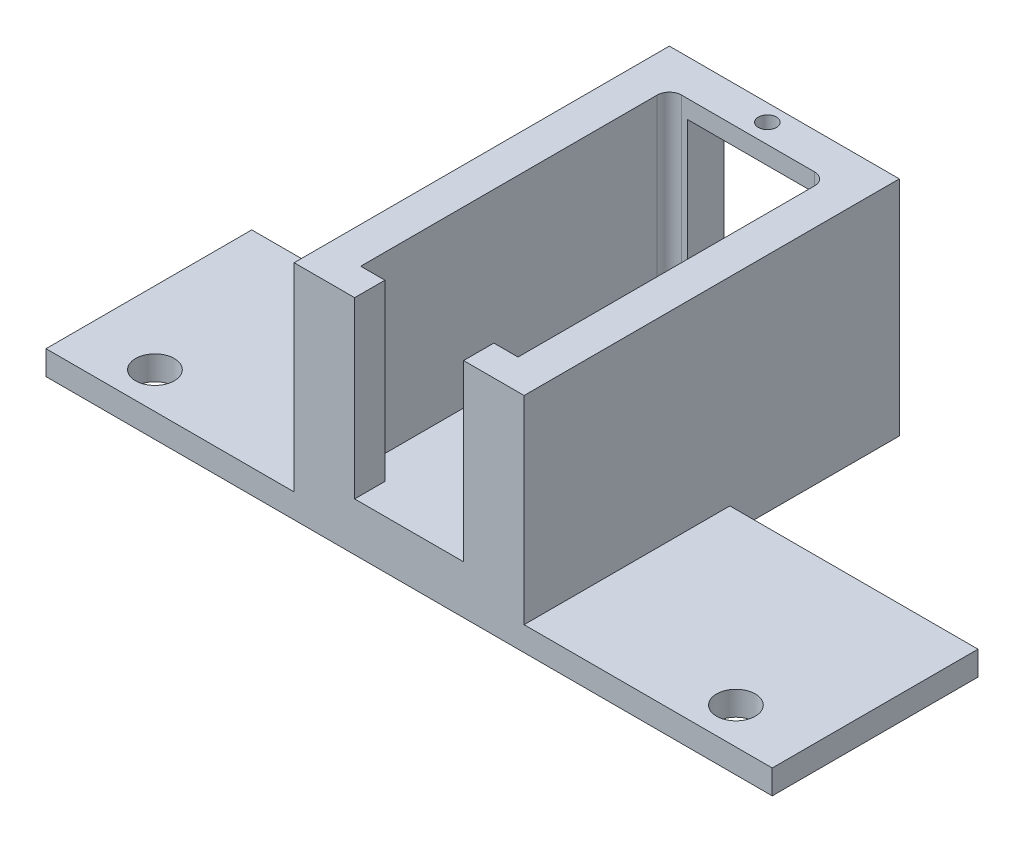
ISO-10303-21;
HEADER;
FILE_DESCRIPTION(('STEP AP214'),'2;1');
FILE_NAME('part.step','',(''),(''),'','','');
FILE_SCHEMA(('AUTOMOTIVE_DESIGN { 1 0 10303 214 1 1 1 1 }'));
ENDSEC;
DATA;
#1=APPLICATION_CONTEXT('core data for automotive mechanical design processes');
#2=APPLICATION_PROTOCOL_DEFINITION('international standard','automotive_design',2000,#1);
#3=PRODUCT_CONTEXT('',#1,'mechanical');
#4=PRODUCT('Part','Part','',(#3));
#5=PRODUCT_RELATED_PRODUCT_CATEGORY('part','',(#4));
#6=PRODUCT_DEFINITION_FORMATION('','',#4);
#7=PRODUCT_DEFINITION_CONTEXT('part definition',#1,'design');
#8=PRODUCT_DEFINITION('design','',#6,#7);
#9=PRODUCT_DEFINITION_SHAPE('','',#8);
#10=(LENGTH_UNIT() NAMED_UNIT(*) SI_UNIT(.MILLI.,.METRE.));
#11=(NAMED_UNIT(*) PLANE_ANGLE_UNIT() SI_UNIT($,.RADIAN.));
#12=(NAMED_UNIT(*) SI_UNIT($,.STERADIAN.) SOLID_ANGLE_UNIT());
#13=UNCERTAINTY_MEASURE_WITH_UNIT(LENGTH_MEASURE(1.E-05),#10,'distance_accuracy_value','');
#14=(GEOMETRIC_REPRESENTATION_CONTEXT(3) GLOBAL_UNCERTAINTY_ASSIGNED_CONTEXT((#13)) GLOBAL_UNIT_ASSIGNED_CONTEXT((#10,
#11,#12)) REPRESENTATION_CONTEXT('',''));
#15=CARTESIAN_POINT('',(0.,0.,0.));
#16=DIRECTION('',(0.,0.,1.));
#17=DIRECTION('',(1.,0.,0.));
#18=AXIS2_PLACEMENT_3D('',#15,#16,#17);
#19=CARTESIAN_POINT('',(-30.,4.,-8.5));
#20=DIRECTION('',(0.,0.,1.));
#21=DIRECTION('',(1.,0.,0.));
#22=AXIS2_PLACEMENT_3D('',#19,#20,#21);
#23=PLANE('',#22);
#24=DIRECTION('',(1.,0.,0.));
#25=VECTOR('',#24,1.);
#26=CARTESIAN_POINT('',(30.,2.,-8.49999999999995));
#27=LINE('',#26,#25);
#28=CARTESIAN_POINT('',(9.49999999999995,2.,-8.49999999999995));
#29=VERTEX_POINT('',#28);
#30=CARTESIAN_POINT('',(30.,2.,-8.49999999999995));
#31=VERTEX_POINT('',#30);
#32=EDGE_CURVE('E270',#29,#31,#27,.T.);
#33=ORIENTED_EDGE('',*,*,#32,.T.);
#34=DIRECTION('',(0.,-1.,0.));
#35=VECTOR('',#34,1.);
#36=CARTESIAN_POINT('',(30.,4.,-8.5));
#37=LINE('',#36,#35);
#38=CARTESIAN_POINT('',(30.,0.,-8.5));
#39=VERTEX_POINT('',#38);
#40=EDGE_CURVE('E469',#31,#39,#37,.T.);
#41=ORIENTED_EDGE('',*,*,#40,.T.);
#42=DIRECTION('',(-1.,0.,0.));
#43=VECTOR('',#42,1.);
#44=CARTESIAN_POINT('',(-30.,0.,-8.5));
#45=LINE('',#44,#43);
#46=CARTESIAN_POINT('',(9.5,0.,-8.5));
#47=VERTEX_POINT('',#46);
#48=EDGE_CURVE('E448',#39,#47,#45,.T.);
#49=ORIENTED_EDGE('',*,*,#48,.T.);
#50=DIRECTION('',(0.,-1.,0.));
#51=VECTOR('',#50,1.);
#52=CARTESIAN_POINT('',(9.5,4.,-8.5));
#53=LINE('',#52,#51);
#54=EDGE_CURVE('E424',#29,#47,#53,.T.);
#55=ORIENTED_EDGE('',*,*,#54,.F.);
#56=EDGE_LOOP('',(#33,#41,#49,#55));
#57=FACE_BOUND('',#56,.T.);
#58=ADVANCED_FACE('F45',(#57),#23,.F.);
#59=CARTESIAN_POINT('',(30.,4.,8.5));
#60=DIRECTION('',(-1.,0.,0.));
#61=DIRECTION('',(0.,0.,1.));
#62=AXIS2_PLACEMENT_3D('',#59,#60,#61);
#63=PLANE('',#62);
#64=DIRECTION('',(0.,0.,1.));
#65=VECTOR('',#64,1.);
#66=CARTESIAN_POINT('',(30.,2.,-8.49999999999995));
#67=LINE('',#66,#65);
#68=CARTESIAN_POINT('',(30.,2.,8.49999999999995));
#69=VERTEX_POINT('',#68);
#70=EDGE_CURVE('E266',#31,#69,#67,.T.);
#71=ORIENTED_EDGE('',*,*,#70,.T.);
#72=DIRECTION('',(0.,-1.,0.));
#73=VECTOR('',#72,1.);
#74=CARTESIAN_POINT('',(30.,4.,8.5));
#75=LINE('',#74,#73);
#76=CARTESIAN_POINT('',(30.,0.,8.5));
#77=VERTEX_POINT('',#76);
#78=EDGE_CURVE('E460',#69,#77,#75,.T.);
#79=ORIENTED_EDGE('',*,*,#78,.T.);
#80=DIRECTION('',(0.,0.,-1.));
#81=VECTOR('',#80,1.);
#82=CARTESIAN_POINT('',(30.,0.,8.5));
#83=LINE('',#82,#81);
#84=EDGE_CURVE('E443',#77,#39,#83,.T.);
#85=ORIENTED_EDGE('',*,*,#84,.T.);
#86=ORIENTED_EDGE('',*,*,#40,.F.);
#87=EDGE_LOOP('',(#71,#79,#85,#86));
#88=FACE_BOUND('',#87,.T.);
#89=ADVANCED_FACE('F521',(#88),#63,.F.);
#90=CARTESIAN_POINT('',(-30.,4.,8.5));
#91=DIRECTION('',(0.,0.,-1.));
#92=DIRECTION('',(-1.,0.,0.));
#93=AXIS2_PLACEMENT_3D('',#90,#91,#92);
#94=PLANE('',#93);
#95=DIRECTION('',(-1.,0.,0.));
#96=VECTOR('',#95,1.);
#97=CARTESIAN_POINT('',(30.,2.,8.49999999999995));
#98=LINE('',#97,#96);
#99=CARTESIAN_POINT('',(9.49999999999995,2.,8.49999999999995));
#100=VERTEX_POINT('',#99);
#101=EDGE_CURVE('E277',#69,#100,#98,.T.);
#102=ORIENTED_EDGE('',*,*,#101,.T.);
#103=DIRECTION('',(0.,-1.,0.));
#104=VECTOR('',#103,1.);
#105=CARTESIAN_POINT('',(9.49999999999999,18.4,8.5));
#106=LINE('',#105,#104);
#107=CARTESIAN_POINT('',(9.49999999999999,18.4,8.5));
#108=VERTEX_POINT('',#107);
#109=EDGE_CURVE('E391',#108,#100,#106,.T.);
#110=ORIENTED_EDGE('',*,*,#109,.F.);
#111=DIRECTION('',(1.,0.,0.));
#112=VECTOR('',#111,1.);
#113=CARTESIAN_POINT('',(-9.49999999999999,18.4,8.5));
#114=LINE('',#113,#112);
#115=CARTESIAN_POINT('',(4.5,18.4,8.5));
#116=VERTEX_POINT('',#115);
#117=EDGE_CURVE('E402',#116,#108,#114,.T.);
#118=ORIENTED_EDGE('',*,*,#117,.F.);
#119=DIRECTION('',(0.,1.,0.));
#120=VECTOR('',#119,1.);
#121=CARTESIAN_POINT('',(4.5,4.,8.5));
#122=LINE('',#121,#120);
#123=CARTESIAN_POINT('',(4.5,4.,8.5));
#124=VERTEX_POINT('',#123);
#125=EDGE_CURVE('E361',#124,#116,#122,.T.);
#126=ORIENTED_EDGE('',*,*,#125,.F.);
#127=DIRECTION('',(1.,0.,0.));
#128=VECTOR('',#127,1.);
#129=CARTESIAN_POINT('',(-4.5,4.,8.5));
#130=LINE('',#129,#128);
#131=CARTESIAN_POINT('',(-4.5,4.,8.5));
#132=VERTEX_POINT('',#131);
#133=EDGE_CURVE('E341',#132,#124,#130,.T.);
#134=ORIENTED_EDGE('',*,*,#133,.F.);
#135=DIRECTION('',(0.,1.,0.));
#136=VECTOR('',#135,1.);
#137=CARTESIAN_POINT('',(-4.5,4.,8.5));
#138=LINE('',#137,#136);
#139=CARTESIAN_POINT('',(-4.5,18.4,8.5));
#140=VERTEX_POINT('',#139);
#141=EDGE_CURVE('E348',#132,#140,#138,.T.);
#142=ORIENTED_EDGE('',*,*,#141,.T.);
#143=CARTESIAN_POINT('',(-9.49999999999999,18.4,8.5));
#144=VERTEX_POINT('',#143);
#145=EDGE_CURVE('E403',#144,#140,#114,.T.);
#146=ORIENTED_EDGE('',*,*,#145,.F.);
#147=DIRECTION('',(0.,-1.,0.));
#148=VECTOR('',#147,1.);
#149=CARTESIAN_POINT('',(-9.49999999999999,18.4,8.5));
#150=LINE('',#149,#148);
#151=CARTESIAN_POINT('',(-9.49999999999995,2.,8.49999999999995));
#152=VERTEX_POINT('',#151);
#153=EDGE_CURVE('E414',#144,#152,#150,.T.);
#154=ORIENTED_EDGE('',*,*,#153,.T.);
#155=DIRECTION('',(1.,0.,0.));
#156=VECTOR('',#155,1.);
#157=CARTESIAN_POINT('',(-30.,2.,8.49999999999995));
#158=LINE('',#157,#156);
#159=CARTESIAN_POINT('',(-30.,2.,8.49999999999995));
#160=VERTEX_POINT('',#159);
#161=EDGE_CURVE('E284',#160,#152,#158,.T.);
#162=ORIENTED_EDGE('',*,*,#161,.F.);
#163=DIRECTION('',(0.,-1.,0.));
#164=VECTOR('',#163,1.);
#165=CARTESIAN_POINT('',(-30.,4.,8.5));
#166=LINE('',#165,#164);
#167=CARTESIAN_POINT('',(-30.,0.,8.5));
#168=VERTEX_POINT('',#167);
#169=EDGE_CURVE('E463',#160,#168,#166,.T.);
#170=ORIENTED_EDGE('',*,*,#169,.T.);
#171=DIRECTION('',(1.,0.,0.));
#172=VECTOR('',#171,1.);
#173=CARTESIAN_POINT('',(-30.,0.,8.5));
#174=LINE('',#173,#172);
#175=EDGE_CURVE('E456',#168,#77,#174,.T.);
#176=ORIENTED_EDGE('',*,*,#175,.T.);
#177=ORIENTED_EDGE('',*,*,#78,.F.);
#178=EDGE_LOOP('',(#102,#110,#118,#126,#134,#142,#146,#154,#162,#170,#176,#177));
#179=FACE_BOUND('',#178,.T.);
#180=ADVANCED_FACE('F526',(#179),#94,.F.);
#181=CARTESIAN_POINT('',(24.,0.,5.5));
#182=DIRECTION('',(0.,1.,0.));
#183=DIRECTION('',(0.,0.,1.));
#184=AXIS2_PLACEMENT_3D('',#181,#182,#183);
#185=CYLINDRICAL_SURFACE('',#184,1.6);
#186=CARTESIAN_POINT('',(24.,0.,5.5));
#187=DIRECTION('',(0.,1.,0.));
#188=DIRECTION('',(0.,0.,1.));
#189=AXIS2_PLACEMENT_3D('',#186,#187,#188);
#190=CIRCLE('',#189,1.6);
#191=CARTESIAN_POINT('',(24.,0.,7.1));
#192=VERTEX_POINT('',#191);
#193=EDGE_CURVE('E299',#192,#192,#190,.T.);
#194=ORIENTED_EDGE('',*,*,#193,.F.);
#195=EDGE_LOOP('',(#194));
#196=FACE_BOUND('',#195,.T.);
#197=CARTESIAN_POINT('',(24.,2.,5.5));
#198=DIRECTION('',(0.,1.,0.));
#199=DIRECTION('',(0.,0.,1.));
#200=AXIS2_PLACEMENT_3D('',#197,#198,#199);
#201=CIRCLE('',#200,1.6);
#202=CARTESIAN_POINT('',(24.,2.,7.1));
#203=VERTEX_POINT('',#202);
#204=EDGE_CURVE('E49',#203,#203,#201,.F.);
#205=ORIENTED_EDGE('',*,*,#204,.F.);
#206=EDGE_LOOP('',(#205));
#207=FACE_BOUND('',#206,.T.);
#208=ADVANCED_FACE('F530',(#196,#207),#185,.F.);
#209=DIRECTION('',(-1.,0.,0.));
#210=VECTOR('',#209,1.);
#211=CARTESIAN_POINT('',(-30.,2.,-8.49999999999995));
#212=LINE('',#211,#210);
#213=CARTESIAN_POINT('',(-9.49999999999995,2.,-8.49999999999995));
#214=VERTEX_POINT('',#213);
#215=CARTESIAN_POINT('',(-30.,2.,-8.49999999999995));
#216=VERTEX_POINT('',#215);
#217=EDGE_CURVE('E291',#214,#216,#212,.T.);
#218=ORIENTED_EDGE('',*,*,#217,.F.);
#219=DIRECTION('',(0.,1.,0.));
#220=VECTOR('',#219,1.);
#221=CARTESIAN_POINT('',(-9.5,4.,-8.5));
#222=LINE('',#221,#220);
#223=CARTESIAN_POINT('',(-9.5,0.,-8.5));
#224=VERTEX_POINT('',#223);
#225=EDGE_CURVE('E419',#224,#214,#222,.T.);
#226=ORIENTED_EDGE('',*,*,#225,.F.);
#227=CARTESIAN_POINT('',(-30.,0.,-8.5));
#228=VERTEX_POINT('',#227);
#229=EDGE_CURVE('E447',#224,#228,#45,.T.);
#230=ORIENTED_EDGE('',*,*,#229,.T.);
#231=DIRECTION('',(0.,-1.,0.));
#232=VECTOR('',#231,1.);
#233=CARTESIAN_POINT('',(-30.,4.,-8.5));
#234=LINE('',#233,#232);
#235=EDGE_CURVE('E466',#216,#228,#234,.T.);
#236=ORIENTED_EDGE('',*,*,#235,.F.);
#237=EDGE_LOOP('',(#218,#226,#230,#236));
#238=FACE_BOUND('',#237,.T.);
#239=ADVANCED_FACE('F514',(#238),#23,.F.);
#240=CARTESIAN_POINT('',(-30.,4.,8.5));
#241=DIRECTION('',(1.,0.,0.));
#242=DIRECTION('',(0.,0.,-1.));
#243=AXIS2_PLACEMENT_3D('',#240,#241,#242);
#244=PLANE('',#243);
#245=DIRECTION('',(0.,0.,1.));
#246=VECTOR('',#245,1.);
#247=CARTESIAN_POINT('',(-30.,2.,-8.49999999999995));
#248=LINE('',#247,#246);
#249=EDGE_CURVE('E281',#216,#160,#248,.T.);
#250=ORIENTED_EDGE('',*,*,#249,.F.);
#251=ORIENTED_EDGE('',*,*,#235,.T.);
#252=DIRECTION('',(0.,0.,1.));
#253=VECTOR('',#252,1.);
#254=CARTESIAN_POINT('',(-30.,0.,8.5));
#255=LINE('',#254,#253);
#256=EDGE_CURVE('E452',#228,#168,#255,.T.);
#257=ORIENTED_EDGE('',*,*,#256,.T.);
#258=ORIENTED_EDGE('',*,*,#169,.F.);
#259=EDGE_LOOP('',(#250,#251,#257,#258));
#260=FACE_BOUND('',#259,.T.);
#261=ADVANCED_FACE('F505',(#260),#244,.F.);
#262=CARTESIAN_POINT('',(-24.,0.,5.5));
#263=DIRECTION('',(0.,1.,0.));
#264=DIRECTION('',(0.,0.,1.));
#265=AXIS2_PLACEMENT_3D('',#262,#263,#264);
#266=CYLINDRICAL_SURFACE('',#265,1.6);
#267=CARTESIAN_POINT('',(-24.,0.,5.5));
#268=DIRECTION('',(0.,1.,0.));
#269=DIRECTION('',(0.,0.,1.));
#270=AXIS2_PLACEMENT_3D('',#267,#268,#269);
#271=CIRCLE('',#270,1.6);
#272=CARTESIAN_POINT('',(-24.,0.,7.1));
#273=VERTEX_POINT('',#272);
#274=EDGE_CURVE('E295',#273,#273,#271,.T.);
#275=ORIENTED_EDGE('',*,*,#274,.F.);
#276=EDGE_LOOP('',(#275));
#277=FACE_BOUND('',#276,.T.);
#278=CARTESIAN_POINT('',(-24.,2.,5.5));
#279=DIRECTION('',(0.,1.,0.));
#280=DIRECTION('',(0.,0.,1.));
#281=AXIS2_PLACEMENT_3D('',#278,#279,#280);
#282=CIRCLE('',#281,1.6);
#283=CARTESIAN_POINT('',(-24.,2.,7.1));
#284=VERTEX_POINT('',#283);
#285=EDGE_CURVE('E294',#284,#284,#282,.F.);
#286=ORIENTED_EDGE('',*,*,#285,.F.);
#287=EDGE_LOOP('',(#286));
#288=FACE_BOUND('',#287,.T.);
#289=ADVANCED_FACE('F502',(#277,#288),#266,.F.);
#290=CARTESIAN_POINT('',(0.,4.,0.));
#291=DIRECTION('',(0.,-1.,0.));
#292=DIRECTION('',(0.,0.,-1.));
#293=AXIS2_PLACEMENT_3D('',#290,#291,#292);
#294=PLANE('',#293);
#295=DIRECTION('',(1.,0.,0.));
#296=VECTOR('',#295,1.);
#297=CARTESIAN_POINT('',(-6.5,4.,-19.5));
#298=LINE('',#297,#296);
#299=CARTESIAN_POINT('',(-5.5,4.,-19.5));
#300=VERTEX_POINT('',#299);
#301=CARTESIAN_POINT('',(-5.,4.,-19.5));
#302=VERTEX_POINT('',#301);
#303=EDGE_CURVE('E333',#300,#302,#298,.T.);
#304=ORIENTED_EDGE('',*,*,#303,.F.);
#305=CARTESIAN_POINT('',(-5.5,4.,-18.5));
#306=DIRECTION('',(0.,-1.,0.));
#307=DIRECTION('',(0.,0.,-1.));
#308=AXIS2_PLACEMENT_3D('',#305,#306,#307);
#309=CIRCLE('',#308,1.);
#310=CARTESIAN_POINT('',(-6.5,4.,-18.5));
#311=VERTEX_POINT('',#310);
#312=EDGE_CURVE('E486',#300,#311,#309,.F.);
#313=ORIENTED_EDGE('',*,*,#312,.T.);
#314=DIRECTION('',(0.,0.,-1.));
#315=VECTOR('',#314,1.);
#316=CARTESIAN_POINT('',(-6.5,4.,-22.5));
#317=LINE('',#316,#315);
#318=CARTESIAN_POINT('',(-6.5,4.,6.));
#319=VERTEX_POINT('',#318);
#320=EDGE_CURVE('E397',#319,#311,#317,.T.);
#321=ORIENTED_EDGE('',*,*,#320,.F.);
#322=DIRECTION('',(-1.,0.,0.));
#323=VECTOR('',#322,1.);
#324=CARTESIAN_POINT('',(-6.5,4.,6.));
#325=LINE('',#324,#323);
#326=CARTESIAN_POINT('',(-4.5,4.,6.));
#327=VERTEX_POINT('',#326);
#328=EDGE_CURVE('E356',#327,#319,#325,.T.);
#329=ORIENTED_EDGE('',*,*,#328,.F.);
#330=DIRECTION('',(0.,0.,1.));
#331=VECTOR('',#330,1.);
#332=CARTESIAN_POINT('',(-4.5,4.,6.));
#333=LINE('',#332,#331);
#334=EDGE_CURVE('E337',#327,#132,#333,.T.);
#335=ORIENTED_EDGE('',*,*,#334,.T.);
#336=ORIENTED_EDGE('',*,*,#133,.T.);
#337=DIRECTION('',(0.,0.,-1.));
#338=VECTOR('',#337,1.);
#339=CARTESIAN_POINT('',(4.5,4.,6.));
#340=LINE('',#339,#338);
#341=CARTESIAN_POINT('',(4.5,4.,6.));
#342=VERTEX_POINT('',#341);
#343=EDGE_CURVE('E346',#124,#342,#340,.T.);
#344=ORIENTED_EDGE('',*,*,#343,.T.);
#345=CARTESIAN_POINT('',(6.5,4.,6.));
#346=VERTEX_POINT('',#345);
#347=EDGE_CURVE('E372',#346,#342,#325,.T.);
#348=ORIENTED_EDGE('',*,*,#347,.F.);
#349=DIRECTION('',(0.,0.,-1.));
#350=VECTOR('',#349,1.);
#351=CARTESIAN_POINT('',(6.5,4.,-22.5));
#352=LINE('',#351,#350);
#353=CARTESIAN_POINT('',(6.5,4.,-18.5));
#354=VERTEX_POINT('',#353);
#355=EDGE_CURVE('E383',#346,#354,#352,.T.);
#356=ORIENTED_EDGE('',*,*,#355,.T.);
#357=CARTESIAN_POINT('',(5.5,4.,-18.5));
#358=DIRECTION('',(0.,-1.,0.));
#359=DIRECTION('',(0.,0.,-1.));
#360=AXIS2_PLACEMENT_3D('',#357,#358,#359);
#361=CIRCLE('',#360,1.);
#362=CARTESIAN_POINT('',(5.5,4.,-19.5));
#363=VERTEX_POINT('',#362);
#364=EDGE_CURVE('E482',#354,#363,#361,.F.);
#365=ORIENTED_EDGE('',*,*,#364,.T.);
#366=CARTESIAN_POINT('',(5.,4.,-19.5));
#367=VERTEX_POINT('',#366);
#368=EDGE_CURVE('E328',#367,#363,#298,.T.);
#369=ORIENTED_EDGE('',*,*,#368,.F.);
#370=DIRECTION('',(-1.,0.,0.));
#371=VECTOR('',#370,1.);
#372=CARTESIAN_POINT('',(0.,4.,-19.5));
#373=LINE('',#372,#371);
#374=EDGE_CURVE('E259',#367,#302,#373,.T.);
#375=ORIENTED_EDGE('',*,*,#374,.T.);
#376=EDGE_LOOP('',(#304,#313,#321,#329,#335,#336,#344,#348,#356,#365,#369,#375));
#377=FACE_BOUND('',#376,.T.);
#378=ADVANCED_FACE('F504',(#377),#294,.F.);
#379=CARTESIAN_POINT('',(-6.5,18.4,-22.5));
#380=DIRECTION('',(-1.,0.,0.));
#381=DIRECTION('',(0.,0.,1.));
#382=AXIS2_PLACEMENT_3D('',#379,#380,#381);
#383=PLANE('',#382);
#384=ORIENTED_EDGE('',*,*,#320,.T.);
#385=DIRECTION('',(0.,-1.,0.));
#386=VECTOR('',#385,1.);
#387=CARTESIAN_POINT('',(-6.5,18.4,-18.5));
#388=LINE('',#387,#386);
#389=CARTESIAN_POINT('',(-6.5,18.4,-18.5));
#390=VERTEX_POINT('',#389);
#391=EDGE_CURVE('E69',#311,#390,#388,.F.);
#392=ORIENTED_EDGE('',*,*,#391,.T.);
#393=DIRECTION('',(0.,0.,-1.));
#394=VECTOR('',#393,1.);
#395=CARTESIAN_POINT('',(-6.5,18.4,-22.5));
#396=LINE('',#395,#394);
#397=CARTESIAN_POINT('',(-6.5,18.4,6.));
#398=VERTEX_POINT('',#397);
#399=EDGE_CURVE('E407',#398,#390,#396,.T.);
#400=ORIENTED_EDGE('',*,*,#399,.F.);
#401=DIRECTION('',(0.,-1.,0.));
#402=VECTOR('',#401,1.);
#403=CARTESIAN_POINT('',(-6.5,18.4,6.));
#404=LINE('',#403,#402);
#405=EDGE_CURVE('E370',#398,#319,#404,.T.);
#406=ORIENTED_EDGE('',*,*,#405,.T.);
#407=EDGE_LOOP('',(#384,#392,#400,#406));
#408=FACE_BOUND('',#407,.T.);
#409=ADVANCED_FACE('F511',(#408),#383,.F.);
#410=CARTESIAN_POINT('',(6.5,18.4,-22.5));
#411=DIRECTION('',(-1.,0.,0.));
#412=DIRECTION('',(0.,0.,1.));
#413=AXIS2_PLACEMENT_3D('',#410,#411,#412);
#414=PLANE('',#413);
#415=DIRECTION('',(0.,0.,-1.));
#416=VECTOR('',#415,1.);
#417=CARTESIAN_POINT('',(6.5,18.4,-22.5));
#418=LINE('',#417,#416);
#419=CARTESIAN_POINT('',(6.5,18.4,6.));
#420=VERTEX_POINT('',#419);
#421=CARTESIAN_POINT('',(6.5,18.4,-18.5));
#422=VERTEX_POINT('',#421);
#423=EDGE_CURVE('E388',#420,#422,#418,.T.);
#424=ORIENTED_EDGE('',*,*,#423,.T.);
#425=DIRECTION('',(0.,-1.,0.));
#426=VECTOR('',#425,1.);
#427=CARTESIAN_POINT('',(6.5,18.4,-18.5));
#428=LINE('',#427,#426);
#429=EDGE_CURVE('E491',#422,#354,#428,.T.);
#430=ORIENTED_EDGE('',*,*,#429,.T.);
#431=ORIENTED_EDGE('',*,*,#355,.F.);
#432=DIRECTION('',(0.,-1.,0.));
#433=VECTOR('',#432,1.);
#434=CARTESIAN_POINT('',(6.5,18.4,6.));
#435=LINE('',#434,#433);
#436=EDGE_CURVE('E379',#420,#346,#435,.T.);
#437=ORIENTED_EDGE('',*,*,#436,.F.);
#438=EDGE_LOOP('',(#424,#430,#431,#437));
#439=FACE_BOUND('',#438,.T.);
#440=ADVANCED_FACE('F739',(#439),#414,.T.);
#441=CARTESIAN_POINT('',(-6.5,18.4,6.));
#442=DIRECTION('',(0.,0.,1.));
#443=DIRECTION('',(1.,0.,0.));
#444=AXIS2_PLACEMENT_3D('',#441,#442,#443);
#445=PLANE('',#444);
#446=DIRECTION('',(-1.,0.,0.));
#447=VECTOR('',#446,1.);
#448=CARTESIAN_POINT('',(-6.5,18.4,6.));
#449=LINE('',#448,#447);
#450=CARTESIAN_POINT('',(-4.5,18.4,6.));
#451=VERTEX_POINT('',#450);
#452=EDGE_CURVE('E371',#451,#398,#449,.T.);
#453=ORIENTED_EDGE('',*,*,#452,.F.);
#454=DIRECTION('',(0.,1.,0.));
#455=VECTOR('',#454,1.);
#456=CARTESIAN_POINT('',(-4.5,4.,6.));
#457=LINE('',#456,#455);
#458=EDGE_CURVE('E353',#327,#451,#457,.T.);
#459=ORIENTED_EDGE('',*,*,#458,.F.);
#460=ORIENTED_EDGE('',*,*,#328,.T.);
#461=ORIENTED_EDGE('',*,*,#405,.F.);
#462=EDGE_LOOP('',(#453,#459,#460,#461));
#463=FACE_BOUND('',#462,.T.);
#464=ADVANCED_FACE('F709',(#463),#445,.F.);
#465=CARTESIAN_POINT('',(0.,0.,0.));
#466=DIRECTION('',(0.,-1.,0.));
#467=DIRECTION('',(0.,0.,-1.));
#468=AXIS2_PLACEMENT_3D('',#465,#466,#467);
#469=PLANE('',#468);
#470=ORIENTED_EDGE('',*,*,#274,.T.);
#471=EDGE_LOOP('',(#470));
#472=FACE_BOUND('',#471,.T.);
#473=ORIENTED_EDGE('',*,*,#193,.T.);
#474=EDGE_LOOP('',(#473));
#475=FACE_BOUND('',#474,.T.);
#476=ORIENTED_EDGE('',*,*,#84,.F.);
#477=ORIENTED_EDGE('',*,*,#175,.F.);
#478=ORIENTED_EDGE('',*,*,#256,.F.);
#479=ORIENTED_EDGE('',*,*,#229,.F.);
#480=DIRECTION('',(0.,0.,1.));
#481=VECTOR('',#480,1.);
#482=CARTESIAN_POINT('',(-9.5,0.,-22.5));
#483=LINE('',#482,#481);
#484=CARTESIAN_POINT('',(-9.5,0.,-22.5));
#485=VERTEX_POINT('',#484);
#486=EDGE_CURVE('E430',#485,#224,#483,.T.);
#487=ORIENTED_EDGE('',*,*,#486,.F.);
#488=DIRECTION('',(-1.,0.,0.));
#489=VECTOR('',#488,1.);
#490=CARTESIAN_POINT('',(-9.5,0.,-22.5));
#491=LINE('',#490,#489);
#492=CARTESIAN_POINT('',(9.5,0.,-22.5));
#493=VERTEX_POINT('',#492);
#494=EDGE_CURVE('E427',#493,#485,#491,.T.);
#495=ORIENTED_EDGE('',*,*,#494,.F.);
#496=DIRECTION('',(0.,0.,1.));
#497=VECTOR('',#496,1.);
#498=CARTESIAN_POINT('',(9.5,0.,-22.5));
#499=LINE('',#498,#497);
#500=EDGE_CURVE('E439',#493,#47,#499,.T.);
#501=ORIENTED_EDGE('',*,*,#500,.T.);
#502=ORIENTED_EDGE('',*,*,#48,.F.);
#503=EDGE_LOOP('',(#476,#477,#478,#479,#487,#495,#501,#502));
#504=FACE_BOUND('',#503,.T.);
#505=ADVANCED_FACE('F551',(#472,#475,#504),#469,.T.);
#506=CARTESIAN_POINT('',(-9.5,4.,-22.5));
#507=DIRECTION('',(1.,0.,0.));
#508=DIRECTION('',(0.,1.,0.));
#509=AXIS2_PLACEMENT_3D('',#506,#507,#508);
#510=PLANE('',#509);
#511=ORIENTED_EDGE('',*,*,#225,.T.);
#512=DIRECTION('',(0.,0.,-1.));
#513=VECTOR('',#512,1.);
#514=CARTESIAN_POINT('',(-9.49999999999995,2.,-8.49999999999995));
#515=LINE('',#514,#513);
#516=EDGE_CURVE('E288',#152,#214,#515,.T.);
#517=ORIENTED_EDGE('',*,*,#516,.F.);
#518=ORIENTED_EDGE('',*,*,#153,.F.);
#519=DIRECTION('',(0.,0.,1.));
#520=VECTOR('',#519,1.);
#521=CARTESIAN_POINT('',(-9.5,18.4,-22.5));
#522=LINE('',#521,#520);
#523=CARTESIAN_POINT('',(-9.5,18.4,-22.5));
#524=VERTEX_POINT('',#523);
#525=EDGE_CURVE('E398',#524,#144,#522,.T.);
#526=ORIENTED_EDGE('',*,*,#525,.F.);
#527=DIRECTION('',(0.,1.,0.));
#528=VECTOR('',#527,1.);
#529=CARTESIAN_POINT('',(-9.5,4.,-22.5));
#530=LINE('',#529,#528);
#531=EDGE_CURVE('E420',#485,#524,#530,.T.);
#532=ORIENTED_EDGE('',*,*,#531,.F.);
#533=ORIENTED_EDGE('',*,*,#486,.T.);
#534=EDGE_LOOP('',(#511,#517,#518,#526,#532,#533));
#535=FACE_BOUND('',#534,.T.);
#536=ADVANCED_FACE('F543',(#535),#510,.F.);
#537=CARTESIAN_POINT('',(9.5,4.,-22.5));
#538=DIRECTION('',(-1.,0.,0.));
#539=DIRECTION('',(0.,0.,1.));
#540=AXIS2_PLACEMENT_3D('',#537,#538,#539);
#541=PLANE('',#540);
#542=DIRECTION('',(0.,0.,-1.));
#543=VECTOR('',#542,1.);
#544=CARTESIAN_POINT('',(9.49999999999995,2.,-8.49999999999995));
#545=LINE('',#544,#543);
#546=EDGE_CURVE('E274',#100,#29,#545,.T.);
#547=ORIENTED_EDGE('',*,*,#546,.T.);
#548=ORIENTED_EDGE('',*,*,#54,.T.);
#549=ORIENTED_EDGE('',*,*,#500,.F.);
#550=DIRECTION('',(0.,-1.,0.));
#551=VECTOR('',#550,1.);
#552=CARTESIAN_POINT('',(9.5,4.,-22.5));
#553=LINE('',#552,#551);
#554=CARTESIAN_POINT('',(9.5,18.4,-22.5));
#555=VERTEX_POINT('',#554);
#556=EDGE_CURVE('E423',#555,#493,#553,.T.);
#557=ORIENTED_EDGE('',*,*,#556,.F.);
#558=DIRECTION('',(0.,0.,1.));
#559=VECTOR('',#558,1.);
#560=CARTESIAN_POINT('',(9.5,18.4,-22.5));
#561=LINE('',#560,#559);
#562=EDGE_CURVE('E384',#555,#108,#561,.T.);
#563=ORIENTED_EDGE('',*,*,#562,.T.);
#564=ORIENTED_EDGE('',*,*,#109,.T.);
#565=EDGE_LOOP('',(#547,#548,#549,#557,#563,#564));
#566=FACE_BOUND('',#565,.T.);
#567=ADVANCED_FACE('F626',(#566),#541,.F.);
#568=CARTESIAN_POINT('',(0.,0.,-22.5));
#569=DIRECTION('',(0.,0.,1.));
#570=DIRECTION('',(1.,0.,0.));
#571=AXIS2_PLACEMENT_3D('',#568,#569,#570);
#572=PLANE('',#571);
#573=DIRECTION('',(-1.,0.,0.));
#574=VECTOR('',#573,1.);
#575=CARTESIAN_POINT('',(5.,3.9,-22.5));
#576=LINE('',#575,#574);
#577=CARTESIAN_POINT('',(5.,3.9,-22.5));
#578=VERTEX_POINT('',#577);
#579=CARTESIAN_POINT('',(-5.,3.9,-22.5));
#580=VERTEX_POINT('',#579);
#581=EDGE_CURVE('E236',#578,#580,#576,.T.);
#582=ORIENTED_EDGE('',*,*,#581,.F.);
#583=DIRECTION('',(0.,-1.,0.));
#584=VECTOR('',#583,1.);
#585=CARTESIAN_POINT('',(5.,16.9,-22.5));
#586=LINE('',#585,#584);
#587=CARTESIAN_POINT('',(5.,16.9,-22.5));
#588=VERTEX_POINT('',#587);
#589=EDGE_CURVE('E216',#588,#578,#586,.T.);
#590=ORIENTED_EDGE('',*,*,#589,.F.);
#591=DIRECTION('',(1.,0.,0.));
#592=VECTOR('',#591,1.);
#593=CARTESIAN_POINT('',(5.,16.9,-22.5));
#594=LINE('',#593,#592);
#595=CARTESIAN_POINT('',(-5.,16.9,-22.5));
#596=VERTEX_POINT('',#595);
#597=EDGE_CURVE('E230',#596,#588,#594,.T.);
#598=ORIENTED_EDGE('',*,*,#597,.F.);
#599=DIRECTION('',(0.,1.,0.));
#600=VECTOR('',#599,1.);
#601=CARTESIAN_POINT('',(-5.,16.9,-22.5));
#602=LINE('',#601,#600);
#603=EDGE_CURVE('E243',#580,#596,#602,.T.);
#604=ORIENTED_EDGE('',*,*,#603,.F.);
#605=EDGE_LOOP('',(#582,#590,#598,#604));
#606=FACE_BOUND('',#605,.T.);
#607=ORIENTED_EDGE('',*,*,#531,.T.);
#608=DIRECTION('',(-1.,0.,0.));
#609=VECTOR('',#608,1.);
#610=CARTESIAN_POINT('',(-9.5,18.4,-22.5));
#611=LINE('',#610,#609);
#612=EDGE_CURVE('E410',#555,#524,#611,.T.);
#613=ORIENTED_EDGE('',*,*,#612,.F.);
#614=ORIENTED_EDGE('',*,*,#556,.T.);
#615=ORIENTED_EDGE('',*,*,#494,.T.);
#616=EDGE_LOOP('',(#607,#613,#614,#615));
#617=FACE_BOUND('',#616,.T.);
#618=ADVANCED_FACE('F241',(#606,#617),#572,.F.);
#619=CARTESIAN_POINT('',(0.,18.4,0.));
#620=DIRECTION('',(0.,1.,0.));
#621=DIRECTION('',(0.,0.,1.));
#622=AXIS2_PLACEMENT_3D('',#619,#620,#621);
#623=PLANE('',#622);
#624=CARTESIAN_POINT('',(0.,18.4,-21.1));
#625=DIRECTION('',(0.,1.,0.));
#626=DIRECTION('',(0.,0.,1.));
#627=AXIS2_PLACEMENT_3D('',#624,#625,#626);
#628=CIRCLE('',#627,0.750000000000001);
#629=CARTESIAN_POINT('',(0.,18.4,-20.35));
#630=VERTEX_POINT('',#629);
#631=EDGE_CURVE('E324',#630,#630,#628,.T.);
#632=ORIENTED_EDGE('',*,*,#631,.F.);
#633=EDGE_LOOP('',(#632));
#634=FACE_BOUND('',#633,.T.);
#635=DIRECTION('',(0.,0.,-1.));
#636=VECTOR('',#635,1.);
#637=CARTESIAN_POINT('',(4.5,18.4,6.));
#638=LINE('',#637,#636);
#639=CARTESIAN_POINT('',(4.5,18.4,6.));
#640=VERTEX_POINT('',#639);
#641=EDGE_CURVE('E342',#116,#640,#638,.T.);
#642=ORIENTED_EDGE('',*,*,#641,.F.);
#643=ORIENTED_EDGE('',*,*,#117,.T.);
#644=ORIENTED_EDGE('',*,*,#562,.F.);
#645=ORIENTED_EDGE('',*,*,#612,.T.);
#646=ORIENTED_EDGE('',*,*,#525,.T.);
#647=ORIENTED_EDGE('',*,*,#145,.T.);
#648=DIRECTION('',(0.,0.,1.));
#649=VECTOR('',#648,1.);
#650=CARTESIAN_POINT('',(-4.5,18.4,6.));
#651=LINE('',#650,#649);
#652=EDGE_CURVE('E332',#451,#140,#651,.T.);
#653=ORIENTED_EDGE('',*,*,#652,.F.);
#654=ORIENTED_EDGE('',*,*,#452,.T.);
#655=ORIENTED_EDGE('',*,*,#399,.T.);
#656=CARTESIAN_POINT('',(-5.5,18.4,-18.5));
#657=DIRECTION('',(0.,1.,0.));
#658=DIRECTION('',(0.,0.,1.));
#659=AXIS2_PLACEMENT_3D('',#656,#657,#658);
#660=CIRCLE('',#659,1.);
#661=CARTESIAN_POINT('',(-5.5,18.4,-19.5));
#662=VERTEX_POINT('',#661);
#663=EDGE_CURVE('E55',#390,#662,#660,.F.);
#664=ORIENTED_EDGE('',*,*,#663,.T.);
#665=DIRECTION('',(1.,0.,0.));
#666=VECTOR('',#665,1.);
#667=CARTESIAN_POINT('',(-6.5,18.4,-19.5));
#668=LINE('',#667,#666);
#669=CARTESIAN_POINT('',(5.5,18.4,-19.5));
#670=VERTEX_POINT('',#669);
#671=EDGE_CURVE('E329',#662,#670,#668,.T.);
#672=ORIENTED_EDGE('',*,*,#671,.T.);
#673=CARTESIAN_POINT('',(5.5,18.4,-18.5));
#674=DIRECTION('',(0.,1.,0.));
#675=DIRECTION('',(0.,0.,1.));
#676=AXIS2_PLACEMENT_3D('',#673,#674,#675);
#677=CIRCLE('',#676,1.);
#678=EDGE_CURVE('E11',#670,#422,#677,.F.);
#679=ORIENTED_EDGE('',*,*,#678,.T.);
#680=ORIENTED_EDGE('',*,*,#423,.F.);
#681=EDGE_CURVE('E367',#420,#640,#449,.T.);
#682=ORIENTED_EDGE('',*,*,#681,.T.);
#683=EDGE_LOOP('',(#642,#643,#644,#645,#646,#647,#653,#654,#655,#664,#672,#679,#680,#682));
#684=FACE_BOUND('',#683,.T.);
#685=ADVANCED_FACE('F625',(#634,#684),#623,.T.);
#686=ORIENTED_EDGE('',*,*,#347,.T.);
#687=DIRECTION('',(0.,1.,0.));
#688=VECTOR('',#687,1.);
#689=CARTESIAN_POINT('',(4.5,4.,6.));
#690=LINE('',#689,#688);
#691=EDGE_CURVE('E357',#342,#640,#690,.T.);
#692=ORIENTED_EDGE('',*,*,#691,.T.);
#693=ORIENTED_EDGE('',*,*,#681,.F.);
#694=ORIENTED_EDGE('',*,*,#436,.T.);
#695=EDGE_LOOP('',(#686,#692,#693,#694));
#696=FACE_BOUND('',#695,.T.);
#697=ADVANCED_FACE('F732',(#696),#445,.F.);
#698=CARTESIAN_POINT('',(-4.5,4.,6.));
#699=DIRECTION('',(-1.,0.,0.));
#700=DIRECTION('',(0.,0.,1.));
#701=AXIS2_PLACEMENT_3D('',#698,#699,#700);
#702=PLANE('',#701);
#703=ORIENTED_EDGE('',*,*,#652,.T.);
#704=ORIENTED_EDGE('',*,*,#141,.F.);
#705=ORIENTED_EDGE('',*,*,#334,.F.);
#706=ORIENTED_EDGE('',*,*,#458,.T.);
#707=EDGE_LOOP('',(#703,#704,#705,#706));
#708=FACE_BOUND('',#707,.T.);
#709=ADVANCED_FACE('F774',(#708),#702,.F.);
#710=CARTESIAN_POINT('',(4.5,4.,6.));
#711=DIRECTION('',(1.,0.,0.));
#712=DIRECTION('',(0.,0.,-1.));
#713=AXIS2_PLACEMENT_3D('',#710,#711,#712);
#714=PLANE('',#713);
#715=ORIENTED_EDGE('',*,*,#641,.T.);
#716=ORIENTED_EDGE('',*,*,#691,.F.);
#717=ORIENTED_EDGE('',*,*,#343,.F.);
#718=ORIENTED_EDGE('',*,*,#125,.T.);
#719=EDGE_LOOP('',(#715,#716,#717,#718));
#720=FACE_BOUND('',#719,.T.);
#721=ADVANCED_FACE('F611',(#720),#714,.F.);
#722=CARTESIAN_POINT('',(-6.5,18.4,-19.5));
#723=DIRECTION('',(0.,0.,-1.));
#724=DIRECTION('',(-1.,0.,0.));
#725=AXIS2_PLACEMENT_3D('',#722,#723,#724);
#726=PLANE('',#725);
#727=DIRECTION('',(0.,-1.,0.));
#728=VECTOR('',#727,1.);
#729=CARTESIAN_POINT('',(5.,16.9,-19.5));
#730=LINE('',#729,#728);
#731=CARTESIAN_POINT('',(5.,16.9,-19.5));
#732=VERTEX_POINT('',#731);
#733=EDGE_CURVE('E310',#732,#367,#730,.T.);
#734=ORIENTED_EDGE('',*,*,#733,.T.);
#735=ORIENTED_EDGE('',*,*,#368,.T.);
#736=DIRECTION('',(0.,-1.,0.));
#737=VECTOR('',#736,1.);
#738=CARTESIAN_POINT('',(5.5,18.4,-19.5));
#739=LINE('',#738,#737);
#740=EDGE_CURVE('E472',#363,#670,#739,.F.);
#741=ORIENTED_EDGE('',*,*,#740,.T.);
#742=ORIENTED_EDGE('',*,*,#671,.F.);
#743=DIRECTION('',(0.,-1.,0.));
#744=VECTOR('',#743,1.);
#745=CARTESIAN_POINT('',(-5.5,4.,-19.5));
#746=LINE('',#745,#744);
#747=EDGE_CURVE('E478',#662,#300,#746,.T.);
#748=ORIENTED_EDGE('',*,*,#747,.T.);
#749=ORIENTED_EDGE('',*,*,#303,.T.);
#750=DIRECTION('',(0.,1.,0.));
#751=VECTOR('',#750,1.);
#752=CARTESIAN_POINT('',(-5.,16.9,-19.5));
#753=LINE('',#752,#751);
#754=CARTESIAN_POINT('',(-5.,16.9,-19.5));
#755=VERTEX_POINT('',#754);
#756=EDGE_CURVE('E229',#302,#755,#753,.T.);
#757=ORIENTED_EDGE('',*,*,#756,.T.);
#758=DIRECTION('',(1.,0.,0.));
#759=VECTOR('',#758,1.);
#760=CARTESIAN_POINT('',(5.,16.9,-19.5));
#761=LINE('',#760,#759);
#762=EDGE_CURVE('E306',#755,#732,#761,.T.);
#763=ORIENTED_EDGE('',*,*,#762,.T.);
#764=EDGE_LOOP('',(#734,#735,#741,#742,#748,#749,#757,#763));
#765=FACE_BOUND('',#764,.T.);
#766=ADVANCED_FACE('F605',(#765),#726,.F.);
#767=CARTESIAN_POINT('',(0.,12.4,-21.1));
#768=DIRECTION('',(0.,1.,0.));
#769=DIRECTION('',(0.,0.,1.));
#770=AXIS2_PLACEMENT_3D('',#767,#768,#769);
#771=CYLINDRICAL_SURFACE('',#770,0.750000000000001);
#772=CARTESIAN_POINT('',(0.,16.9,-21.1));
#773=DIRECTION('',(0.,1.,0.));
#774=DIRECTION('',(0.,0.,1.));
#775=AXIS2_PLACEMENT_3D('',#772,#773,#774);
#776=CIRCLE('',#775,0.750000000000001);
#777=CARTESIAN_POINT('',(0.,16.9,-20.35));
#778=VERTEX_POINT('',#777);
#779=EDGE_CURVE('E320',#778,#778,#776,.F.);
#780=ORIENTED_EDGE('',*,*,#779,.T.);
#781=EDGE_LOOP('',(#780));
#782=FACE_BOUND('',#781,.T.);
#783=ORIENTED_EDGE('',*,*,#631,.T.);
#784=EDGE_LOOP('',(#783));
#785=FACE_BOUND('',#784,.T.);
#786=ADVANCED_FACE('F610',(#782,#785),#771,.F.);
#787=CARTESIAN_POINT('',(5.,16.9,-19.5));
#788=DIRECTION('',(0.,1.,0.));
#789=DIRECTION('',(0.,0.,1.));
#790=AXIS2_PLACEMENT_3D('',#787,#788,#789);
#791=PLANE('',#790);
#792=ORIENTED_EDGE('',*,*,#597,.T.);
#793=DIRECTION('',(0.,0.,-1.));
#794=VECTOR('',#793,1.);
#795=CARTESIAN_POINT('',(5.,16.9,-19.5));
#796=LINE('',#795,#794);
#797=EDGE_CURVE('E223',#732,#588,#796,.T.);
#798=ORIENTED_EDGE('',*,*,#797,.F.);
#799=ORIENTED_EDGE('',*,*,#762,.F.);
#800=DIRECTION('',(0.,0.,-1.));
#801=VECTOR('',#800,1.);
#802=CARTESIAN_POINT('',(-5.,16.9,-19.5));
#803=LINE('',#802,#801);
#804=EDGE_CURVE('E313',#755,#596,#803,.T.);
#805=ORIENTED_EDGE('',*,*,#804,.T.);
#806=EDGE_LOOP('',(#792,#798,#799,#805));
#807=FACE_BOUND('',#806,.T.);
#808=ORIENTED_EDGE('',*,*,#779,.F.);
#809=EDGE_LOOP('',(#808));
#810=FACE_BOUND('',#809,.T.);
#811=ADVANCED_FACE('F597',(#807,#810),#791,.F.);
#812=CARTESIAN_POINT('',(-5.,16.9,-19.5));
#813=DIRECTION('',(-1.,0.,0.));
#814=DIRECTION('',(0.,-1.,0.));
#815=AXIS2_PLACEMENT_3D('',#812,#813,#814);
#816=PLANE('',#815);
#817=ORIENTED_EDGE('',*,*,#603,.T.);
#818=ORIENTED_EDGE('',*,*,#804,.F.);
#819=ORIENTED_EDGE('',*,*,#756,.F.);
#820=DIRECTION('',(0.,1.,0.));
#821=VECTOR('',#820,1.);
#822=CARTESIAN_POINT('',(-5.,3.9,-19.5));
#823=LINE('',#822,#821);
#824=CARTESIAN_POINT('',(-5.,3.9,-19.5));
#825=VERTEX_POINT('',#824);
#826=EDGE_CURVE('E255',#825,#302,#823,.T.);
#827=ORIENTED_EDGE('',*,*,#826,.F.);
#828=DIRECTION('',(0.,0.,1.));
#829=VECTOR('',#828,1.);
#830=CARTESIAN_POINT('',(-5.,3.9,-22.5));
#831=LINE('',#830,#829);
#832=EDGE_CURVE('E246',#580,#825,#831,.T.);
#833=ORIENTED_EDGE('',*,*,#832,.F.);
#834=EDGE_LOOP('',(#817,#818,#819,#827,#833));
#835=FACE_BOUND('',#834,.T.);
#836=ADVANCED_FACE('F587',(#835),#816,.F.);
#837=CARTESIAN_POINT('',(5.,16.9,-19.5));
#838=DIRECTION('',(1.,0.,0.));
#839=DIRECTION('',(0.,1.,0.));
#840=AXIS2_PLACEMENT_3D('',#837,#838,#839);
#841=PLANE('',#840);
#842=ORIENTED_EDGE('',*,*,#589,.T.);
#843=DIRECTION('',(0.,0.,-1.));
#844=VECTOR('',#843,1.);
#845=CARTESIAN_POINT('',(5.,3.9,-22.5));
#846=LINE('',#845,#844);
#847=CARTESIAN_POINT('',(5.,3.9,-19.5));
#848=VERTEX_POINT('',#847);
#849=EDGE_CURVE('E220',#848,#578,#846,.T.);
#850=ORIENTED_EDGE('',*,*,#849,.F.);
#851=DIRECTION('',(0.,1.,0.));
#852=VECTOR('',#851,1.);
#853=CARTESIAN_POINT('',(5.,3.9,-19.5));
#854=LINE('',#853,#852);
#855=EDGE_CURVE('E256',#848,#367,#854,.T.);
#856=ORIENTED_EDGE('',*,*,#855,.T.);
#857=ORIENTED_EDGE('',*,*,#733,.F.);
#858=ORIENTED_EDGE('',*,*,#797,.T.);
#859=EDGE_LOOP('',(#842,#850,#856,#857,#858));
#860=FACE_BOUND('',#859,.T.);
#861=ADVANCED_FACE('F218',(#860),#841,.F.);
#862=CARTESIAN_POINT('',(-5.5,18.4,-18.5));
#863=DIRECTION('',(0.,1.,0.));
#864=DIRECTION('',(0.,0.,1.));
#865=AXIS2_PLACEMENT_3D('',#862,#863,#864);
#866=CYLINDRICAL_SURFACE('',#865,1.);
#867=ORIENTED_EDGE('',*,*,#663,.F.);
#868=ORIENTED_EDGE('',*,*,#391,.F.);
#869=ORIENTED_EDGE('',*,*,#312,.F.);
#870=ORIENTED_EDGE('',*,*,#747,.F.);
#871=EDGE_LOOP('',(#867,#868,#869,#870));
#872=FACE_BOUND('',#871,.T.);
#873=ADVANCED_FACE('F586',(#872),#866,.F.);
#874=CARTESIAN_POINT('',(5.5,18.4,-18.5));
#875=DIRECTION('',(0.,-1.,0.));
#876=DIRECTION('',(0.,0.,-1.));
#877=AXIS2_PLACEMENT_3D('',#874,#875,#876);
#878=CYLINDRICAL_SURFACE('',#877,1.);
#879=ORIENTED_EDGE('',*,*,#678,.F.);
#880=ORIENTED_EDGE('',*,*,#740,.F.);
#881=ORIENTED_EDGE('',*,*,#364,.F.);
#882=ORIENTED_EDGE('',*,*,#429,.F.);
#883=EDGE_LOOP('',(#879,#880,#881,#882));
#884=FACE_BOUND('',#883,.T.);
#885=ADVANCED_FACE('F47',(#884),#878,.F.);
#886=CARTESIAN_POINT('',(0.,2.,0.));
#887=DIRECTION('',(0.,1.,0.));
#888=DIRECTION('',(0.,0.,1.));
#889=AXIS2_PLACEMENT_3D('',#886,#887,#888);
#890=PLANE('',#889);
#891=ORIENTED_EDGE('',*,*,#249,.T.);
#892=ORIENTED_EDGE('',*,*,#161,.T.);
#893=ORIENTED_EDGE('',*,*,#516,.T.);
#894=ORIENTED_EDGE('',*,*,#217,.T.);
#895=EDGE_LOOP('',(#891,#892,#893,#894));
#896=FACE_BOUND('',#895,.T.);
#897=ORIENTED_EDGE('',*,*,#285,.T.);
#898=EDGE_LOOP('',(#897));
#899=FACE_BOUND('',#898,.T.);
#900=ADVANCED_FACE('F500',(#896,#899),#890,.T.);
#901=CARTESIAN_POINT('',(0.,2.,0.));
#902=DIRECTION('',(0.,1.,0.));
#903=DIRECTION('',(0.,0.,1.));
#904=AXIS2_PLACEMENT_3D('',#901,#902,#903);
#905=PLANE('',#904);
#906=ORIENTED_EDGE('',*,*,#70,.F.);
#907=ORIENTED_EDGE('',*,*,#32,.F.);
#908=ORIENTED_EDGE('',*,*,#546,.F.);
#909=ORIENTED_EDGE('',*,*,#101,.F.);
#910=EDGE_LOOP('',(#906,#907,#908,#909));
#911=FACE_BOUND('',#910,.T.);
#912=ORIENTED_EDGE('',*,*,#204,.T.);
#913=EDGE_LOOP('',(#912));
#914=FACE_BOUND('',#913,.T.);
#915=ADVANCED_FACE('F559',(#911,#914),#905,.T.);
#916=CARTESIAN_POINT('',(5.,3.9,-19.5));
#917=DIRECTION('',(0.,0.,1.));
#918=DIRECTION('',(1.,0.,0.));
#919=AXIS2_PLACEMENT_3D('',#916,#917,#918);
#920=PLANE('',#919);
#921=ORIENTED_EDGE('',*,*,#855,.F.);
#922=DIRECTION('',(1.,0.,0.));
#923=VECTOR('',#922,1.);
#924=CARTESIAN_POINT('',(5.,3.9,-19.5));
#925=LINE('',#924,#923);
#926=EDGE_CURVE('E238',#825,#848,#925,.T.);
#927=ORIENTED_EDGE('',*,*,#926,.F.);
#928=ORIENTED_EDGE('',*,*,#826,.T.);
#929=ORIENTED_EDGE('',*,*,#374,.F.);
#930=EDGE_LOOP('',(#921,#927,#928,#929));
#931=FACE_BOUND('',#930,.T.);
#932=ADVANCED_FACE('F562',(#931),#920,.F.);
#933=CARTESIAN_POINT('',(0.,3.9,0.));
#934=DIRECTION('',(0.,-1.,0.));
#935=DIRECTION('',(0.,0.,-1.));
#936=AXIS2_PLACEMENT_3D('',#933,#934,#935);
#937=PLANE('',#936);
#938=ORIENTED_EDGE('',*,*,#849,.T.);
#939=ORIENTED_EDGE('',*,*,#581,.T.);
#940=ORIENTED_EDGE('',*,*,#832,.T.);
#941=ORIENTED_EDGE('',*,*,#926,.T.);
#942=EDGE_LOOP('',(#938,#939,#940,#941));
#943=FACE_BOUND('',#942,.T.);
#944=ADVANCED_FACE('F234',(#943),#937,.F.);
#945=CLOSED_SHELL('',(#58,#89,#180,#208,#239,#261,#289,#378,#409,#440,#464,#505,#536,#567,#618,
#685,#697,#709,#721,#766,#786,#811,#836,#861,#873,#885,#900,#915,#932,#944));
#946=MANIFOLD_SOLID_BREP('B2',#945);
#947=ADVANCED_BREP_SHAPE_REPRESENTATION('',(#18,#946),#14);
#948=SHAPE_DEFINITION_REPRESENTATION(#9,#947);
ENDSEC;
END-ISO-10303-21;
